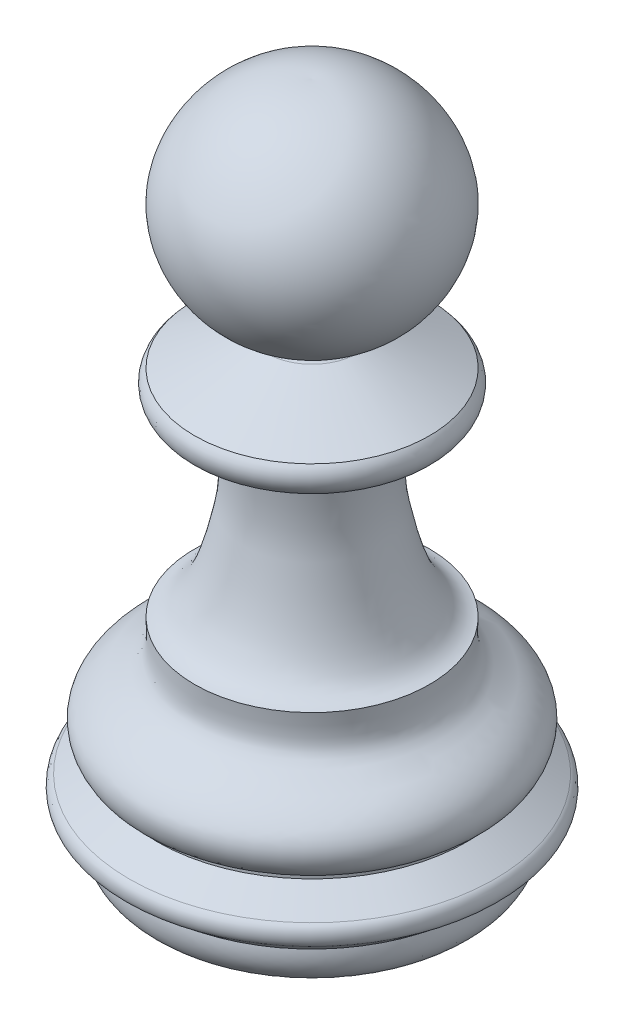
ISO-10303-21;
HEADER;
FILE_DESCRIPTION(('STEP AP214'),'2;1');
FILE_NAME('part.step','',(''),(''),'','','');
FILE_SCHEMA(('AUTOMOTIVE_DESIGN { 1 0 10303 214 1 1 1 1 }'));
ENDSEC;
DATA;
#1=APPLICATION_CONTEXT('core data for automotive mechanical design processes');
#2=APPLICATION_PROTOCOL_DEFINITION('international standard','automotive_design',2000,#1);
#3=PRODUCT_CONTEXT('',#1,'mechanical');
#4=PRODUCT('Part','Part','',(#3));
#5=PRODUCT_RELATED_PRODUCT_CATEGORY('part','',(#4));
#6=PRODUCT_DEFINITION_FORMATION('','',#4);
#7=PRODUCT_DEFINITION_CONTEXT('part definition',#1,'design');
#8=PRODUCT_DEFINITION('design','',#6,#7);
#9=PRODUCT_DEFINITION_SHAPE('','',#8);
#10=(LENGTH_UNIT() NAMED_UNIT(*) SI_UNIT(.MILLI.,.METRE.));
#11=(NAMED_UNIT(*) PLANE_ANGLE_UNIT() SI_UNIT($,.RADIAN.));
#12=(NAMED_UNIT(*) SI_UNIT($,.STERADIAN.) SOLID_ANGLE_UNIT());
#13=UNCERTAINTY_MEASURE_WITH_UNIT(LENGTH_MEASURE(1.E-05),#10,'distance_accuracy_value','');
#14=(GEOMETRIC_REPRESENTATION_CONTEXT(3) GLOBAL_UNCERTAINTY_ASSIGNED_CONTEXT((#13)) GLOBAL_UNIT_ASSIGNED_CONTEXT((#10,
#11,#12)) REPRESENTATION_CONTEXT('',''));
#15=CARTESIAN_POINT('',(0.,0.,0.));
#16=DIRECTION('',(0.,0.,1.));
#17=DIRECTION('',(1.,0.,0.));
#18=AXIS2_PLACEMENT_3D('',#15,#16,#17);
#19=CARTESIAN_POINT('',(118.834523645345,18.5348335364474,0.));
#20=CARTESIAN_POINT('',(120.52491264529,18.9706844427902,0.));
#21=CARTESIAN_POINT('',(122.773650121369,22.0643263194966,0.));
#22=CARTESIAN_POINT('',(120.403758441219,26.0126709921946,0.));
#23=CARTESIAN_POINT('',(118.129533272062,26.7339373985939,0.));
#24=CARTESIAN_POINT('',(117.15,26.6703769276852,0.));
#25=B_SPLINE_CURVE_WITH_KNOTS('',3,(#19,#20,#21,#22,#23,#24),.UNSPECIFIED.,.F.,.F.,(4,1,1,4),
(0.,0.437276395774624,0.756810173814984,1.),.UNSPECIFIED.);
#26=CARTESIAN_POINT('',(117.15,26.6703769276852,0.));
#27=DIRECTION('',(0.,1.,0.));
#28=AXIS1_PLACEMENT('',#26,#27);
#29=SURFACE_OF_REVOLUTION('',#25,#28);
#30=CARTESIAN_POINT('',(117.15,18.5747129479768,0.));
#31=DIRECTION('',(0.,1.,0.));
#32=DIRECTION('',(0.,0.,1.));
#33=AXIS2_PLACEMENT_3D('',#30,#31,#32);
#34=CIRCLE('',#33,1.82596533819093);
#35=CARTESIAN_POINT('',(117.15,18.5747129479768,1.82596533819093));
#36=VERTEX_POINT('',#35);
#37=EDGE_CURVE('E96',#36,#36,#34,.T.);
#38=ORIENTED_EDGE('',*,*,#37,.T.);
#39=EDGE_LOOP('',(#38));
#40=FACE_BOUND('',#39,.T.);
#41=CARTESIAN_POINT('',(117.15,26.6703769276852,0.));
#42=VERTEX_POINT('',#41);
#43=VERTEX_LOOP('',#42);
#44=FACE_BOUND('',#43,.T.);
#45=ADVANCED_FACE('F32',(#40,#44),#29,.T.);
#46=CARTESIAN_POINT('',(117.15,26.6703769276852,0.));
#47=DIRECTION('',(0.,1.,0.));
#48=DIRECTION('',(0.,0.,1.));
#49=AXIS2_PLACEMENT_3D('',#46,#47,#48);
#50=CYLINDRICAL_SURFACE('',#49,1.6845236453446);
#51=CARTESIAN_POINT('',(117.15,18.3641407958694,0.));
#52=DIRECTION('',(0.,1.,0.));
#53=DIRECTION('',(0.,0.,1.));
#54=AXIS2_PLACEMENT_3D('',#51,#52,#53);
#55=CIRCLE('',#54,1.6845236453446);
#56=CARTESIAN_POINT('',(117.15,18.3641407958694,1.6845236453446));
#57=VERTEX_POINT('',#56);
#58=EDGE_CURVE('E39',#57,#57,#55,.T.);
#59=ORIENTED_EDGE('',*,*,#58,.T.);
#60=EDGE_LOOP('',(#59));
#61=FACE_BOUND('',#60,.T.);
#62=CARTESIAN_POINT('',(117.15,18.3834776879872,0.));
#63=DIRECTION('',(0.,1.,0.));
#64=DIRECTION('',(0.,0.,1.));
#65=AXIS2_PLACEMENT_3D('',#62,#63,#64);
#66=CIRCLE('',#65,1.6845236453446);
#67=CARTESIAN_POINT('',(117.15,18.3834776879872,1.6845236453446));
#68=VERTEX_POINT('',#67);
#69=EDGE_CURVE('E98',#68,#68,#66,.F.);
#70=ORIENTED_EDGE('',*,*,#69,.T.);
#71=EDGE_LOOP('',(#70));
#72=FACE_BOUND('',#71,.T.);
#73=ADVANCED_FACE('F43',(#61,#72),#50,.T.);
#74=CARTESIAN_POINT('',(117.15,16.8138459469206,0.));
#75=DIRECTION('',(0.,-1.,0.));
#76=DIRECTION('',(0.,0.,-1.));
#77=AXIS2_PLACEMENT_3D('',#74,#75,#76);
#78=CONICAL_SURFACE('',#77,4.62402375969649,1.11583647187057);
#79=CARTESIAN_POINT('',(117.15,18.202450635323,0.));
#80=DIRECTION('',(0.,-1.,0.));
#81=DIRECTION('',(0.,0.,-1.));
#82=AXIS2_PLACEMENT_3D('',#79,#80,#81);
#83=CIRCLE('',#82,1.78542691985954);
#84=CARTESIAN_POINT('',(117.15,18.202450635323,-1.78542691985954));
#85=VERTEX_POINT('',#84);
#86=EDGE_CURVE('E11',#85,#85,#83,.T.);
#87=ORIENTED_EDGE('',*,*,#86,.T.);
#88=EDGE_LOOP('',(#87));
#89=FACE_BOUND('',#88,.T.);
#90=CARTESIAN_POINT('',(117.15,16.8138459469206,0.));
#91=DIRECTION('',(0.,1.,0.));
#92=DIRECTION('',(0.,0.,1.));
#93=AXIS2_PLACEMENT_3D('',#90,#91,#92);
#94=CIRCLE('',#93,4.62402375969649);
#95=CARTESIAN_POINT('',(117.15,16.8138459469206,4.62402375969649));
#96=VERTEX_POINT('',#95);
#97=EDGE_CURVE('E93',#96,#96,#94,.T.);
#98=ORIENTED_EDGE('',*,*,#97,.T.);
#99=EDGE_LOOP('',(#98));
#100=FACE_BOUND('',#99,.T.);
#101=ADVANCED_FACE('F49',(#89,#100),#78,.T.);
#102=CARTESIAN_POINT('',(121.509349383445,15.676913328074,0.));
#103=CARTESIAN_POINT('',(121.516240301186,15.676913328074,0.));
#104=CARTESIAN_POINT('',(121.65405865601,15.676913328074,0.));
#105=CARTESIAN_POINT('',(122.0621182221,16.0601920724237,0.));
#106=CARTESIAN_POINT('',(122.018502113834,16.5526784415521,0.));
#107=CARTESIAN_POINT('',(121.774023759696,16.8138459469206,0.));
#108=B_SPLINE_CURVE_WITH_KNOTS('',3,(#102,#103,#104,#105,#106,#107),.UNSPECIFIED.,.F.,.F.,(4,1,
1,4),(0.,0.0153257538153515,0.30651507630703,1.),.UNSPECIFIED.);
#109=CARTESIAN_POINT('',(117.15,26.6703769276852,0.));
#110=DIRECTION('',(0.,1.,0.));
#111=AXIS1_PLACEMENT('',#109,#110);
#112=SURFACE_OF_REVOLUTION('',#108,#111);
#113=ORIENTED_EDGE('',*,*,#97,.F.);
#114=EDGE_LOOP('',(#113));
#115=FACE_BOUND('',#114,.T.);
#116=CARTESIAN_POINT('',(117.15,15.676913328074,0.));
#117=DIRECTION('',(0.,1.,0.));
#118=DIRECTION('',(0.,0.,1.));
#119=AXIS2_PLACEMENT_3D('',#116,#117,#118);
#120=CIRCLE('',#119,4.35934938344489);
#121=CARTESIAN_POINT('',(117.15,15.676913328074,4.35934938344489));
#122=VERTEX_POINT('',#121);
#123=EDGE_CURVE('E90',#122,#122,#120,.T.);
#124=ORIENTED_EDGE('',*,*,#123,.T.);
#125=EDGE_LOOP('',(#124));
#126=FACE_BOUND('',#125,.T.);
#127=ADVANCED_FACE('F121',(#115,#126),#112,.T.);
#128=CARTESIAN_POINT('',(119.919538357885,15.676913328074,0.));
#129=DIRECTION('',(0.,1.,0.));
#130=DIRECTION('',(0.,0.,1.));
#131=AXIS2_PLACEMENT_3D('',#128,#129,#130);
#132=PLANE('',#131);
#133=CARTESIAN_POINT('',(117.15,15.676913328074,0.));
#134=DIRECTION('',(0.,1.,0.));
#135=DIRECTION('',(0.,0.,1.));
#136=AXIS2_PLACEMENT_3D('',#133,#134,#135);
#137=CIRCLE('',#136,3.21125137733151);
#138=CARTESIAN_POINT('',(117.15,15.676913328074,3.21125137733151));
#139=VERTEX_POINT('',#138);
#140=EDGE_CURVE('E101',#139,#139,#137,.T.);
#141=ORIENTED_EDGE('',*,*,#140,.T.);
#142=EDGE_LOOP('',(#141));
#143=FACE_BOUND('',#142,.T.);
#144=ORIENTED_EDGE('',*,*,#123,.F.);
#145=EDGE_LOOP('',(#144));
#146=FACE_BOUND('',#145,.T.);
#147=ADVANCED_FACE('F126',(#143,#146),#132,.F.);
#148=CARTESIAN_POINT('',(121.774023759696,8.33486252909524,0.));
#149=CARTESIAN_POINT('',(121.325189708611,8.42387781039999,0.));
#150=CARTESIAN_POINT('',(120.554441222644,9.16473370392236,0.));
#151=CARTESIAN_POINT('',(120.096578500146,10.9818340858066,0.));
#152=CARTESIAN_POINT('',(119.831852035251,12.2576199422152,0.));
#153=CARTESIAN_POINT('',(119.613893379986,13.3662342769974,0.));
#154=CARTESIAN_POINT('',(119.919538357885,15.676913328074,0.));
#155=B_SPLINE_CURVE_WITH_KNOTS('',3,(#148,#149,#150,#151,#152,#153,#154),.UNSPECIFIED.,.F.,.F.,
(4,1,1,1,4),(0.,0.21351271178382,0.653955017499873,0.738109275142942,1.),.UNSPECIFIED.);
#156=CARTESIAN_POINT('',(117.15,26.6703769276852,0.));
#157=DIRECTION('',(0.,1.,0.));
#158=AXIS1_PLACEMENT('',#156,#157);
#159=SURFACE_OF_REVOLUTION('',#155,#158);
#160=CARTESIAN_POINT('',(117.15,15.2343889432942,0.));
#161=DIRECTION('',(0.,1.,0.));
#162=DIRECTION('',(0.,0.,1.));
#163=AXIS2_PLACEMENT_3D('',#160,#161,#162);
#164=CIRCLE('',#163,2.71456580913464);
#165=CARTESIAN_POINT('',(117.15,15.2343889432942,2.71456580913464));
#166=VERTEX_POINT('',#165);
#167=EDGE_CURVE('E104',#166,#166,#164,.F.);
#168=ORIENTED_EDGE('',*,*,#167,.T.);
#169=EDGE_LOOP('',(#168));
#170=FACE_BOUND('',#169,.T.);
#171=CARTESIAN_POINT('',(117.15,8.33486252909523,0.));
#172=DIRECTION('',(0.,1.,0.));
#173=DIRECTION('',(0.,0.,1.));
#174=AXIS2_PLACEMENT_3D('',#171,#172,#173);
#175=CIRCLE('',#174,4.62402375969646);
#176=CARTESIAN_POINT('',(117.15,8.33486252909523,4.62402375969646));
#177=VERTEX_POINT('',#176);
#178=EDGE_CURVE('E87',#177,#177,#175,.T.);
#179=ORIENTED_EDGE('',*,*,#178,.T.);
#180=EDGE_LOOP('',(#179));
#181=FACE_BOUND('',#180,.T.);
#182=ADVANCED_FACE('F131',(#170,#181),#159,.T.);
#183=CARTESIAN_POINT('',(123.240177492167,3.91626635832855,0.));
#184=CARTESIAN_POINT('',(123.723083145996,3.99125366931858,0.));
#185=CARTESIAN_POINT('',(124.306653388472,5.1017422844534,0.));
#186=CARTESIAN_POINT('',(123.081672794797,6.26599787867468,0.));
#187=CARTESIAN_POINT('',(121.685037397573,6.83780469334296,0.));
#188=CARTESIAN_POINT('',(121.75203472558,7.83007640599826,0.));
#189=CARTESIAN_POINT('',(121.774023759696,8.33486252909524,0.));
#190=B_SPLINE_CURVE_WITH_KNOTS('',3,(#183,#184,#185,#186,#187,#188,#189),.UNSPECIFIED.,.F.,.F.,
(4,1,1,1,4),(0.,0.24496324690681,0.538873497829879,0.805631519423887,1.),.UNSPECIFIED.);
#191=CARTESIAN_POINT('',(117.15,26.6703769276852,0.));
#192=DIRECTION('',(0.,1.,0.));
#193=AXIS1_PLACEMENT('',#191,#192);
#194=SURFACE_OF_REVOLUTION('',#190,#193);
#195=ORIENTED_EDGE('',*,*,#178,.F.);
#196=EDGE_LOOP('',(#195));
#197=FACE_BOUND('',#196,.T.);
#198=CARTESIAN_POINT('',(117.15,3.91626635832855,0.));
#199=DIRECTION('',(0.,1.,0.));
#200=DIRECTION('',(0.,0.,1.));
#201=AXIS2_PLACEMENT_3D('',#198,#199,#200);
#202=CIRCLE('',#201,6.09017749216735);
#203=CARTESIAN_POINT('',(117.15,3.91626635832855,6.09017749216735));
#204=VERTEX_POINT('',#203);
#205=EDGE_CURVE('E84',#204,#204,#202,.T.);
#206=ORIENTED_EDGE('',*,*,#205,.T.);
#207=EDGE_LOOP('',(#206));
#208=FACE_BOUND('',#207,.T.);
#209=ADVANCED_FACE('F137',(#197,#208),#194,.T.);
#210=CARTESIAN_POINT('',(117.15,26.6703769276852,0.));
#211=DIRECTION('',(0.,1.,0.));
#212=DIRECTION('',(0.,0.,1.));
#213=AXIS2_PLACEMENT_3D('',#210,#211,#212);
#214=CYLINDRICAL_SURFACE('',#213,6.09017749216735);
#215=ORIENTED_EDGE('',*,*,#205,.F.);
#216=EDGE_LOOP('',(#215));
#217=FACE_BOUND('',#216,.T.);
#218=CARTESIAN_POINT('',(117.15,3.70178194251428,0.));
#219=DIRECTION('',(0.,1.,0.));
#220=DIRECTION('',(0.,0.,1.));
#221=AXIS2_PLACEMENT_3D('',#218,#219,#220);
#222=CIRCLE('',#221,6.09017749216735);
#223=CARTESIAN_POINT('',(117.15,3.70178194251428,6.09017749216735));
#224=VERTEX_POINT('',#223);
#225=EDGE_CURVE('E81',#224,#224,#222,.T.);
#226=ORIENTED_EDGE('',*,*,#225,.T.);
#227=EDGE_LOOP('',(#226));
#228=FACE_BOUND('',#227,.T.);
#229=ADVANCED_FACE('F176',(#217,#228),#214,.T.);
#230=CARTESIAN_POINT('',(117.15,2.99001842555495,0.));
#231=DIRECTION('',(0.,-1.,0.));
#232=DIRECTION('',(0.,0.,-1.));
#233=AXIS2_PLACEMENT_3D('',#230,#231,#232);
#234=CONICAL_SURFACE('',#233,7.19552085805193,0.998700235153296);
#235=ORIENTED_EDGE('',*,*,#225,.F.);
#236=EDGE_LOOP('',(#235));
#237=FACE_BOUND('',#236,.T.);
#238=CARTESIAN_POINT('',(117.15,2.99001842555495,0.));
#239=DIRECTION('',(0.,1.,0.));
#240=DIRECTION('',(0.,0.,1.));
#241=AXIS2_PLACEMENT_3D('',#238,#239,#240);
#242=CIRCLE('',#241,7.19552085805193);
#243=CARTESIAN_POINT('',(117.15,2.99001842555495,7.19552085805193));
#244=VERTEX_POINT('',#243);
#245=EDGE_CURVE('E78',#244,#244,#242,.T.);
#246=ORIENTED_EDGE('',*,*,#245,.T.);
#247=EDGE_LOOP('',(#246));
#248=FACE_BOUND('',#247,.T.);
#249=ADVANCED_FACE('F172',(#237,#248),#234,.T.);
#250=CARTESIAN_POINT('',(124.419970049909,2.23063666861196,0.));
#251=CARTESIAN_POINT('',(124.424970044262,2.23464643993192,0.));
#252=CARTESIAN_POINT('',(124.524969931329,2.31484186633115,0.));
#253=CARTESIAN_POINT('',(124.599258113795,2.63778409331861,0.));
#254=CARTESIAN_POINT('',(124.466950358662,2.91182635322257,0.));
#255=CARTESIAN_POINT('',(124.351303215224,2.98629499353912,0.));
#256=CARTESIAN_POINT('',(124.345520858052,2.99001842555495,0.));
#257=B_SPLINE_CURVE_WITH_KNOTS('',3,(#250,#251,#252,#253,#254,#255,#256),.UNSPECIFIED.,.F.,.F.,
(4,1,1,1,4),(0.,0.0248826273859122,0.497652547718243,0.974882627385912,1.),.UNSPECIFIED.);
#258=CARTESIAN_POINT('',(117.15,26.6703769276852,0.));
#259=DIRECTION('',(0.,1.,0.));
#260=AXIS1_PLACEMENT('',#258,#259);
#261=SURFACE_OF_REVOLUTION('',#257,#260);
#262=ORIENTED_EDGE('',*,*,#245,.F.);
#263=EDGE_LOOP('',(#262));
#264=FACE_BOUND('',#263,.T.);
#265=CARTESIAN_POINT('',(117.15,2.23063666861196,0.));
#266=DIRECTION('',(0.,1.,0.));
#267=DIRECTION('',(0.,0.,1.));
#268=AXIS2_PLACEMENT_3D('',#265,#266,#267);
#269=CIRCLE('',#268,7.26997004990909);
#270=CARTESIAN_POINT('',(117.15,2.23063666861196,7.26997004990909));
#271=VERTEX_POINT('',#270);
#272=EDGE_CURVE('E75',#271,#271,#269,.T.);
#273=ORIENTED_EDGE('',*,*,#272,.T.);
#274=EDGE_LOOP('',(#273));
#275=FACE_BOUND('',#274,.T.);
#276=ADVANCED_FACE('F167',(#264,#275),#261,.T.);
#277=CARTESIAN_POINT('',(117.15,1.4988747526338,0.));
#278=DIRECTION('',(0.,1.,0.));
#279=DIRECTION('',(0.,0.,1.));
#280=AXIS2_PLACEMENT_3D('',#277,#278,#279);
#281=CONICAL_SURFACE('',#280,6.35749770275887,0.894864344451105);
#282=ORIENTED_EDGE('',*,*,#272,.F.);
#283=EDGE_LOOP('',(#282));
#284=FACE_BOUND('',#283,.T.);
#285=CARTESIAN_POINT('',(117.15,1.4988747526338,0.));
#286=DIRECTION('',(0.,1.,0.));
#287=DIRECTION('',(0.,0.,1.));
#288=AXIS2_PLACEMENT_3D('',#285,#286,#287);
#289=CIRCLE('',#288,6.35749770275887);
#290=CARTESIAN_POINT('',(117.15,1.4988747526338,6.35749770275887));
#291=VERTEX_POINT('',#290);
#292=EDGE_CURVE('E72',#291,#291,#289,.T.);
#293=ORIENTED_EDGE('',*,*,#292,.T.);
#294=EDGE_LOOP('',(#293));
#295=FACE_BOUND('',#294,.T.);
#296=ADVANCED_FACE('F171',(#284,#295),#281,.T.);
#297=CARTESIAN_POINT('',(122.68907671577,0.,0.));
#298=CARTESIAN_POINT('',(123.720180187687,0.413269006318651,0.));
#299=CARTESIAN_POINT('',(123.507497702759,1.4988747526338,0.));
#300=B_SPLINE_CURVE_WITH_KNOTS('',2,(#297,#298,#299),.UNSPECIFIED.,.F.,.F.,(3,3),(0.,1.),.UNSPECIFIED.);
#301=CARTESIAN_POINT('',(117.15,26.6703769276852,0.));
#302=DIRECTION('',(0.,1.,0.));
#303=AXIS1_PLACEMENT('',#301,#302);
#304=SURFACE_OF_REVOLUTION('',#300,#303);
#305=ORIENTED_EDGE('',*,*,#292,.F.);
#306=EDGE_LOOP('',(#305));
#307=FACE_BOUND('',#306,.T.);
#308=CARTESIAN_POINT('',(117.15,0.,0.));
#309=DIRECTION('',(0.,1.,0.));
#310=DIRECTION('',(0.,0.,1.));
#311=AXIS2_PLACEMENT_3D('',#308,#309,#310);
#312=CIRCLE('',#311,5.53907671577021);
#313=CARTESIAN_POINT('',(117.15,0.,5.53907671577021));
#314=VERTEX_POINT('',#313);
#315=EDGE_CURVE('E66',#314,#314,#312,.T.);
#316=ORIENTED_EDGE('',*,*,#315,.T.);
#317=EDGE_LOOP('',(#316));
#318=FACE_BOUND('',#317,.T.);
#319=ADVANCED_FACE('F194',(#307,#318),#304,.T.);
#320=CARTESIAN_POINT('',(117.15,0.,0.));
#321=DIRECTION('',(0.,1.,0.));
#322=DIRECTION('',(0.,0.,1.));
#323=AXIS2_PLACEMENT_3D('',#320,#321,#322);
#324=PLANE('',#323);
#325=ORIENTED_EDGE('',*,*,#315,.F.);
#326=EDGE_LOOP('',(#325));
#327=FACE_BOUND('',#326,.T.);
#328=ADVANCED_FACE('F199',(#327),#324,.F.);
#329=CARTESIAN_POINT('',(117.15,18.3834776879872,0.));
#330=DIRECTION('',(0.,1.,0.));
#331=DIRECTION('',(0.,0.,1.));
#332=AXIS2_PLACEMENT_3D('',#329,#330,#331);
#333=TOROIDAL_SURFACE('',#332,1.88452364534461,0.2);
#334=ORIENTED_EDGE('',*,*,#69,.F.);
#335=EDGE_LOOP('',(#334));
#336=FACE_BOUND('',#335,.T.);
#337=ORIENTED_EDGE('',*,*,#37,.F.);
#338=EDGE_LOOP('',(#337));
#339=FACE_BOUND('',#338,.T.);
#340=ADVANCED_FACE('F56',(#336,#339),#333,.F.);
#341=CARTESIAN_POINT('',(117.15,15.176913328074,0.));
#342=DIRECTION('',(0.,1.,0.));
#343=DIRECTION('',(0.,0.,1.));
#344=AXIS2_PLACEMENT_3D('',#341,#342,#343);
#345=TOROIDAL_SURFACE('',#344,3.21125137733151,0.5);
#346=ORIENTED_EDGE('',*,*,#167,.F.);
#347=EDGE_LOOP('',(#346));
#348=FACE_BOUND('',#347,.T.);
#349=ORIENTED_EDGE('',*,*,#140,.F.);
#350=EDGE_LOOP('',(#349));
#351=FACE_BOUND('',#350,.T.);
#352=ADVANCED_FACE('F111',(#348,#351),#345,.F.);
#353=CARTESIAN_POINT('',(117.15,18.3641407958694,0.));
#354=DIRECTION('',(0.,1.,0.));
#355=DIRECTION('',(0.,0.,1.));
#356=AXIS2_PLACEMENT_3D('',#353,#354,#355);
#357=TOROIDAL_SURFACE('',#356,1.8645236453446,0.18);
#358=ORIENTED_EDGE('',*,*,#86,.F.);
#359=EDGE_LOOP('',(#358));
#360=FACE_BOUND('',#359,.T.);
#361=ORIENTED_EDGE('',*,*,#58,.F.);
#362=EDGE_LOOP('',(#361));
#363=FACE_BOUND('',#362,.T.);
#364=ADVANCED_FACE('F34',(#360,#363),#357,.F.);
#365=CLOSED_SHELL('',(#45,#73,#101,#127,#147,#182,#209,#229,#249,#276,#296,#319,#328,#340,#352,#364));
#366=MANIFOLD_SOLID_BREP('B2',#365);
#367=ADVANCED_BREP_SHAPE_REPRESENTATION('',(#18,#366),#14);
#368=SHAPE_DEFINITION_REPRESENTATION(#9,#367);
ENDSEC;
END-ISO-10303-21;
